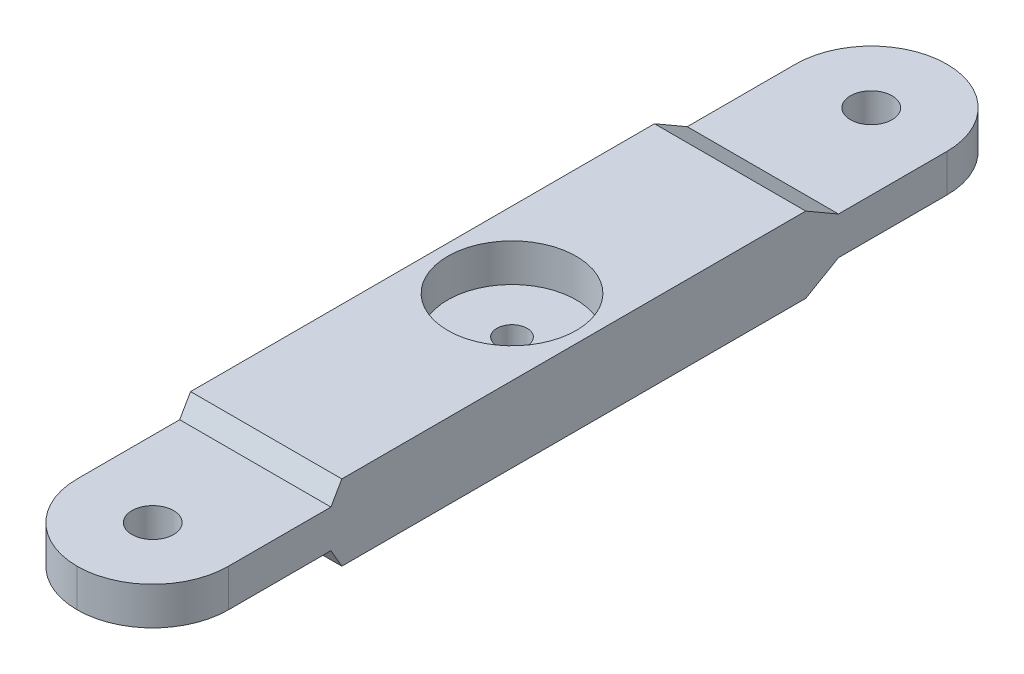
ISO-10303-21;
HEADER;
FILE_DESCRIPTION(('STEP AP214'),'2;1');
FILE_NAME('part.step','',(''),(''),'','','');
FILE_SCHEMA(('AUTOMOTIVE_DESIGN { 1 0 10303 214 1 1 1 1 }'));
ENDSEC;
DATA;
#1=APPLICATION_CONTEXT('core data for automotive mechanical design processes');
#2=APPLICATION_PROTOCOL_DEFINITION('international standard','automotive_design',2000,#1);
#3=PRODUCT_CONTEXT('',#1,'mechanical');
#4=PRODUCT('Part','Part','',(#3));
#5=PRODUCT_RELATED_PRODUCT_CATEGORY('part','',(#4));
#6=PRODUCT_DEFINITION_FORMATION('','',#4);
#7=PRODUCT_DEFINITION_CONTEXT('part definition',#1,'design');
#8=PRODUCT_DEFINITION('design','',#6,#7);
#9=PRODUCT_DEFINITION_SHAPE('','',#8);
#10=(LENGTH_UNIT() NAMED_UNIT(*) SI_UNIT(.MILLI.,.METRE.));
#11=(NAMED_UNIT(*) PLANE_ANGLE_UNIT() SI_UNIT($,.RADIAN.));
#12=(NAMED_UNIT(*) SI_UNIT($,.STERADIAN.) SOLID_ANGLE_UNIT());
#13=UNCERTAINTY_MEASURE_WITH_UNIT(LENGTH_MEASURE(1.E-05),#10,'distance_accuracy_value','');
#14=(GEOMETRIC_REPRESENTATION_CONTEXT(3) GLOBAL_UNCERTAINTY_ASSIGNED_CONTEXT((#13)) GLOBAL_UNIT_ASSIGNED_CONTEXT((#10,
#11,#12)) REPRESENTATION_CONTEXT('',''));
#15=CARTESIAN_POINT('',(0.,0.,0.));
#16=DIRECTION('',(0.,0.,1.));
#17=DIRECTION('',(1.,0.,0.));
#18=AXIS2_PLACEMENT_3D('',#15,#16,#17);
#19=CARTESIAN_POINT('',(-10.,-5.,-37.5));
#20=DIRECTION('',(-1.,0.,0.));
#21=DIRECTION('',(0.,0.,1.));
#22=AXIS2_PLACEMENT_3D('',#19,#20,#21);
#23=PLANE('',#22);
#24=DIRECTION('',(0.,0.866025403784441,0.499999999999996));
#25=VECTOR('',#24,1.);
#26=CARTESIAN_POINT('',(-10.,-35.3108891324552,15.0000000000002));
#27=LINE('',#26,#25);
#28=CARTESIAN_POINT('',(-10.,-5.,32.4999999999999));
#29=VERTEX_POINT('',#28);
#30=CARTESIAN_POINT('',(-10.,-2.5,33.943375672974));
#31=VERTEX_POINT('',#30);
#32=EDGE_CURVE('E254',#29,#31,#27,.T.);
#33=ORIENTED_EDGE('',*,*,#32,.T.);
#34=DIRECTION('',(0.,0.,-1.));
#35=VECTOR('',#34,1.);
#36=CARTESIAN_POINT('',(-10.,-2.5,57.5));
#37=LINE('',#36,#35);
#38=CARTESIAN_POINT('',(-10.,-2.5,47.5));
#39=VERTEX_POINT('',#38);
#40=EDGE_CURVE('E57',#39,#31,#37,.T.);
#41=ORIENTED_EDGE('',*,*,#40,.F.);
#42=DIRECTION('',(0.,1.,0.));
#43=VECTOR('',#42,1.);
#44=CARTESIAN_POINT('',(-10.,-5.,47.5));
#45=LINE('',#44,#43);
#46=CARTESIAN_POINT('',(-10.,2.5,47.5));
#47=VERTEX_POINT('',#46);
#48=EDGE_CURVE('E157',#39,#47,#45,.T.);
#49=ORIENTED_EDGE('',*,*,#48,.T.);
#50=DIRECTION('',(0.,0.,-1.));
#51=VECTOR('',#50,1.);
#52=CARTESIAN_POINT('',(-10.,2.5,57.5));
#53=LINE('',#52,#51);
#54=CARTESIAN_POINT('',(-10.,2.5,33.943375672974));
#55=VERTEX_POINT('',#54);
#56=EDGE_CURVE('E278',#47,#55,#53,.T.);
#57=ORIENTED_EDGE('',*,*,#56,.T.);
#58=DIRECTION('',(0.,0.866025403784441,-0.499999999999996));
#59=VECTOR('',#58,1.);
#60=CARTESIAN_POINT('',(-10.,27.8108891324551,19.3301270189224));
#61=LINE('',#60,#59);
#62=CARTESIAN_POINT('',(-10.,5.,32.4999999999999));
#63=VERTEX_POINT('',#62);
#64=EDGE_CURVE('E251',#55,#63,#61,.T.);
#65=ORIENTED_EDGE('',*,*,#64,.T.);
#66=DIRECTION('',(0.,0.,1.));
#67=VECTOR('',#66,1.);
#68=CARTESIAN_POINT('',(-10.,5.,-37.5));
#69=LINE('',#68,#67);
#70=CARTESIAN_POINT('',(-10.,5.,-28.8397459621554));
#71=VERTEX_POINT('',#70);
#72=EDGE_CURVE('E173',#71,#63,#69,.T.);
#73=ORIENTED_EDGE('',*,*,#72,.F.);
#74=DIRECTION('',(0.,0.499999999999997,0.866025403784441));
#75=VECTOR('',#74,1.);
#76=CARTESIAN_POINT('',(-10.,-1.25000000000003,-39.6650635094611));
#77=LINE('',#76,#75);
#78=CARTESIAN_POINT('',(-10.,2.5,-33.1698729810777));
#79=VERTEX_POINT('',#78);
#80=EDGE_CURVE('E248',#71,#79,#77,.F.);
#81=ORIENTED_EDGE('',*,*,#80,.T.);
#82=DIRECTION('',(0.,0.,1.));
#83=VECTOR('',#82,1.);
#84=CARTESIAN_POINT('',(-10.,2.5,-57.5));
#85=LINE('',#84,#83);
#86=CARTESIAN_POINT('',(-10.,2.5,-47.5));
#87=VERTEX_POINT('',#86);
#88=EDGE_CURVE('E74',#87,#79,#85,.T.);
#89=ORIENTED_EDGE('',*,*,#88,.F.);
#90=DIRECTION('',(0.,1.,0.));
#91=VECTOR('',#90,1.);
#92=CARTESIAN_POINT('',(-10.,-5.,-47.5));
#93=LINE('',#92,#91);
#94=CARTESIAN_POINT('',(-10.,-2.5,-47.5));
#95=VERTEX_POINT('',#94);
#96=EDGE_CURVE('E177',#87,#95,#93,.F.);
#97=ORIENTED_EDGE('',*,*,#96,.T.);
#98=DIRECTION('',(0.,0.,1.));
#99=VECTOR('',#98,1.);
#100=CARTESIAN_POINT('',(-10.,-2.5,-57.5));
#101=LINE('',#100,#99);
#102=CARTESIAN_POINT('',(-10.,-2.5,-33.1698729810777));
#103=VERTEX_POINT('',#102);
#104=EDGE_CURVE('E82',#95,#103,#101,.T.);
#105=ORIENTED_EDGE('',*,*,#104,.T.);
#106=DIRECTION('',(0.,0.499999999999997,-0.866025403784441));
#107=VECTOR('',#106,1.);
#108=CARTESIAN_POINT('',(-10.,-1.24999999999994,-35.3349364905389));
#109=LINE('',#108,#107);
#110=CARTESIAN_POINT('',(-10.,-5.,-28.8397459621554));
#111=VERTEX_POINT('',#110);
#112=EDGE_CURVE('E245',#103,#111,#109,.F.);
#113=ORIENTED_EDGE('',*,*,#112,.T.);
#114=DIRECTION('',(0.,0.,1.));
#115=VECTOR('',#114,1.);
#116=CARTESIAN_POINT('',(-10.,-5.,-37.5));
#117=LINE('',#116,#115);
#118=EDGE_CURVE('E183',#111,#29,#117,.T.);
#119=ORIENTED_EDGE('',*,*,#118,.T.);
#120=EDGE_LOOP('',(#33,#41,#49,#57,#65,#73,#81,#89,#97,#105,#113,#119));
#121=FACE_BOUND('',#120,.T.);
#122=ADVANCED_FACE('F38',(#121),#23,.T.);
#123=CARTESIAN_POINT('',(-10.,5.,-37.5));
#124=DIRECTION('',(0.,1.,0.));
#125=DIRECTION('',(0.,0.,1.));
#126=AXIS2_PLACEMENT_3D('',#123,#124,#125);
#127=PLANE('',#126);
#128=CARTESIAN_POINT('',(0.,5.,0.));
#129=DIRECTION('',(0.,1.,0.));
#130=DIRECTION('',(0.,0.,1.));
#131=AXIS2_PLACEMENT_3D('',#128,#129,#130);
#132=CIRCLE('',#131,8.5);
#133=CARTESIAN_POINT('',(0.,5.,8.5));
#134=VERTEX_POINT('',#133);
#135=EDGE_CURVE('E422',#134,#134,#132,.T.);
#136=ORIENTED_EDGE('',*,*,#135,.F.);
#137=EDGE_LOOP('',(#136));
#138=FACE_BOUND('',#137,.T.);
#139=ORIENTED_EDGE('',*,*,#72,.T.);
#140=DIRECTION('',(1.,0.,0.));
#141=VECTOR('',#140,1.);
#142=CARTESIAN_POINT('',(10.,5.,32.4999999999999));
#143=LINE('',#142,#141);
#144=CARTESIAN_POINT('',(10.,5.,32.4999999999999));
#145=VERTEX_POINT('',#144);
#146=EDGE_CURVE('E261',#63,#145,#143,.T.);
#147=ORIENTED_EDGE('',*,*,#146,.T.);
#148=DIRECTION('',(0.,0.,1.));
#149=VECTOR('',#148,1.);
#150=CARTESIAN_POINT('',(10.,5.,-37.5));
#151=LINE('',#150,#149);
#152=CARTESIAN_POINT('',(10.,5.,-28.8397459621554));
#153=VERTEX_POINT('',#152);
#154=EDGE_CURVE('E180',#153,#145,#151,.T.);
#155=ORIENTED_EDGE('',*,*,#154,.F.);
#156=DIRECTION('',(-1.,0.,0.));
#157=VECTOR('',#156,1.);
#158=CARTESIAN_POINT('',(-10.,5.,-28.8397459621554));
#159=LINE('',#158,#157);
#160=EDGE_CURVE('E257',#153,#71,#159,.T.);
#161=ORIENTED_EDGE('',*,*,#160,.T.);
#162=EDGE_LOOP('',(#139,#147,#155,#161));
#163=FACE_BOUND('',#162,.T.);
#164=ADVANCED_FACE('F286',(#138,#163),#127,.T.);
#165=CARTESIAN_POINT('',(10.,-5.,-37.5));
#166=DIRECTION('',(1.,0.,0.));
#167=DIRECTION('',(0.,0.,-1.));
#168=AXIS2_PLACEMENT_3D('',#165,#166,#167);
#169=PLANE('',#168);
#170=DIRECTION('',(0.,0.,-1.));
#171=VECTOR('',#170,1.);
#172=CARTESIAN_POINT('',(10.,-2.5,57.5));
#173=LINE('',#172,#171);
#174=CARTESIAN_POINT('',(10.,-2.5,47.5));
#175=VERTEX_POINT('',#174);
#176=CARTESIAN_POINT('',(10.,-2.5,33.943375672974));
#177=VERTEX_POINT('',#176);
#178=EDGE_CURVE('E219',#175,#177,#173,.T.);
#179=ORIENTED_EDGE('',*,*,#178,.T.);
#180=DIRECTION('',(0.,-0.866025403784441,-0.499999999999996));
#181=VECTOR('',#180,1.);
#182=CARTESIAN_POINT('',(10.,-35.3108891324552,15.0000000000002));
#183=LINE('',#182,#181);
#184=CARTESIAN_POINT('',(10.,-5.,32.4999999999999));
#185=VERTEX_POINT('',#184);
#186=EDGE_CURVE('E234',#177,#185,#183,.T.);
#187=ORIENTED_EDGE('',*,*,#186,.T.);
#188=DIRECTION('',(0.,0.,1.));
#189=VECTOR('',#188,1.);
#190=CARTESIAN_POINT('',(10.,-5.,-37.5));
#191=LINE('',#190,#189);
#192=CARTESIAN_POINT('',(10.,-5.,-28.8397459621554));
#193=VERTEX_POINT('',#192);
#194=EDGE_CURVE('E307',#193,#185,#191,.T.);
#195=ORIENTED_EDGE('',*,*,#194,.F.);
#196=DIRECTION('',(0.,-0.499999999999997,0.866025403784441));
#197=VECTOR('',#196,1.);
#198=CARTESIAN_POINT('',(10.,-1.24999999999994,-35.3349364905389));
#199=LINE('',#198,#197);
#200=CARTESIAN_POINT('',(10.,-2.5,-33.1698729810777));
#201=VERTEX_POINT('',#200);
#202=EDGE_CURVE('E214',#193,#201,#199,.F.);
#203=ORIENTED_EDGE('',*,*,#202,.T.);
#204=DIRECTION('',(0.,0.,1.));
#205=VECTOR('',#204,1.);
#206=CARTESIAN_POINT('',(10.,-2.5,-57.5));
#207=LINE('',#206,#205);
#208=CARTESIAN_POINT('',(10.,-2.5,-47.5));
#209=VERTEX_POINT('',#208);
#210=EDGE_CURVE('E152',#209,#201,#207,.T.);
#211=ORIENTED_EDGE('',*,*,#210,.F.);
#212=DIRECTION('',(0.,-1.,0.));
#213=VECTOR('',#212,1.);
#214=CARTESIAN_POINT('',(10.,-5.,-47.5));
#215=LINE('',#214,#213);
#216=CARTESIAN_POINT('',(10.,2.5,-47.5));
#217=VERTEX_POINT('',#216);
#218=EDGE_CURVE('E146',#209,#217,#215,.F.);
#219=ORIENTED_EDGE('',*,*,#218,.T.);
#220=DIRECTION('',(0.,0.,1.));
#221=VECTOR('',#220,1.);
#222=CARTESIAN_POINT('',(10.,2.5,-57.5));
#223=LINE('',#222,#221);
#224=CARTESIAN_POINT('',(10.,2.5,-33.1698729810777));
#225=VERTEX_POINT('',#224);
#226=EDGE_CURVE('E149',#217,#225,#223,.T.);
#227=ORIENTED_EDGE('',*,*,#226,.T.);
#228=DIRECTION('',(0.,-0.499999999999997,-0.866025403784441));
#229=VECTOR('',#228,1.);
#230=CARTESIAN_POINT('',(10.,-1.25000000000003,-39.6650635094611));
#231=LINE('',#230,#229);
#232=EDGE_CURVE('E227',#225,#153,#231,.F.);
#233=ORIENTED_EDGE('',*,*,#232,.T.);
#234=ORIENTED_EDGE('',*,*,#154,.T.);
#235=DIRECTION('',(0.,-0.866025403784441,0.499999999999996));
#236=VECTOR('',#235,1.);
#237=CARTESIAN_POINT('',(10.,27.8108891324551,19.3301270189224));
#238=LINE('',#237,#236);
#239=CARTESIAN_POINT('',(10.,2.5,33.943375672974));
#240=VERTEX_POINT('',#239);
#241=EDGE_CURVE('E230',#145,#240,#238,.T.);
#242=ORIENTED_EDGE('',*,*,#241,.T.);
#243=DIRECTION('',(0.,0.,-1.));
#244=VECTOR('',#243,1.);
#245=CARTESIAN_POINT('',(10.,2.5,57.5));
#246=LINE('',#245,#244);
#247=CARTESIAN_POINT('',(10.,2.5,47.5));
#248=VERTEX_POINT('',#247);
#249=EDGE_CURVE('E280',#248,#240,#246,.T.);
#250=ORIENTED_EDGE('',*,*,#249,.F.);
#251=DIRECTION('',(0.,-1.,0.));
#252=VECTOR('',#251,1.);
#253=CARTESIAN_POINT('',(10.,-5.,47.5));
#254=LINE('',#253,#252);
#255=EDGE_CURVE('E211',#248,#175,#254,.T.);
#256=ORIENTED_EDGE('',*,*,#255,.T.);
#257=EDGE_LOOP('',(#179,#187,#195,#203,#211,#219,#227,#233,#234,#242,#250,#256));
#258=FACE_BOUND('',#257,.T.);
#259=ADVANCED_FACE('F148',(#258),#169,.T.);
#260=CARTESIAN_POINT('',(-10.,-5.,-37.5));
#261=DIRECTION('',(0.,-1.,0.));
#262=DIRECTION('',(0.,0.,-1.));
#263=AXIS2_PLACEMENT_3D('',#260,#261,#262);
#264=PLANE('',#263);
#265=CARTESIAN_POINT('',(0.,-5.,0.));
#266=DIRECTION('',(0.,1.,0.));
#267=DIRECTION('',(0.,0.,1.));
#268=AXIS2_PLACEMENT_3D('',#265,#266,#267);
#269=CIRCLE('',#268,2.);
#270=CARTESIAN_POINT('',(0.,-5.,2.));
#271=VERTEX_POINT('',#270);
#272=EDGE_CURVE('E428',#271,#271,#269,.T.);
#273=ORIENTED_EDGE('',*,*,#272,.T.);
#274=EDGE_LOOP('',(#273));
#275=FACE_BOUND('',#274,.T.);
#276=ORIENTED_EDGE('',*,*,#194,.T.);
#277=DIRECTION('',(-1.,0.,0.));
#278=VECTOR('',#277,1.);
#279=CARTESIAN_POINT('',(-10.,-5.,32.4999999999999));
#280=LINE('',#279,#278);
#281=EDGE_CURVE('E241',#185,#29,#280,.T.);
#282=ORIENTED_EDGE('',*,*,#281,.T.);
#283=ORIENTED_EDGE('',*,*,#118,.F.);
#284=DIRECTION('',(1.,0.,0.));
#285=VECTOR('',#284,1.);
#286=CARTESIAN_POINT('',(-10.,-5.,-28.8397459621554));
#287=LINE('',#286,#285);
#288=EDGE_CURVE('E237',#111,#193,#287,.T.);
#289=ORIENTED_EDGE('',*,*,#288,.T.);
#290=EDGE_LOOP('',(#276,#282,#283,#289));
#291=FACE_BOUND('',#290,.T.);
#292=ADVANCED_FACE('F318',(#275,#291),#264,.T.);
#293=CARTESIAN_POINT('',(10.,-2.5,-57.5));
#294=DIRECTION('',(0.,1.,0.));
#295=DIRECTION('',(0.,0.,1.));
#296=AXIS2_PLACEMENT_3D('',#293,#294,#295);
#297=PLANE('',#296);
#298=CARTESIAN_POINT('',(0.,-2.5,-47.5));
#299=DIRECTION('',(0.,1.,0.));
#300=DIRECTION('',(0.,0.,1.));
#301=AXIS2_PLACEMENT_3D('',#298,#299,#300);
#302=CIRCLE('',#301,2.75);
#303=CARTESIAN_POINT('',(0.,-2.5,-44.75));
#304=VERTEX_POINT('',#303);
#305=EDGE_CURVE('E195',#304,#304,#302,.T.);
#306=ORIENTED_EDGE('',*,*,#305,.T.);
#307=EDGE_LOOP('',(#306));
#308=FACE_BOUND('',#307,.T.);
#309=ORIENTED_EDGE('',*,*,#104,.F.);
#310=CARTESIAN_POINT('',(0.,-2.5,-47.5));
#311=DIRECTION('',(0.,1.,0.));
#312=DIRECTION('',(0.,0.,1.));
#313=AXIS2_PLACEMENT_3D('',#310,#311,#312);
#314=CIRCLE('',#313,10.);
#315=CARTESIAN_POINT('',(0.,-2.5,-57.5));
#316=VERTEX_POINT('',#315);
#317=EDGE_CURVE('E158',#95,#316,#314,.F.);
#318=ORIENTED_EDGE('',*,*,#317,.T.);
#319=CARTESIAN_POINT('',(0.,-2.5,-47.5));
#320=DIRECTION('',(0.,1.,0.));
#321=DIRECTION('',(0.,0.,1.));
#322=AXIS2_PLACEMENT_3D('',#319,#320,#321);
#323=CIRCLE('',#322,10.);
#324=EDGE_CURVE('E188',#316,#209,#323,.F.);
#325=ORIENTED_EDGE('',*,*,#324,.T.);
#326=ORIENTED_EDGE('',*,*,#210,.T.);
#327=DIRECTION('',(1.,0.,0.));
#328=VECTOR('',#327,1.);
#329=CARTESIAN_POINT('',(10.,-2.5,-33.1698729810777));
#330=LINE('',#329,#328);
#331=EDGE_CURVE('E11',#201,#103,#330,.F.);
#332=ORIENTED_EDGE('',*,*,#331,.T.);
#333=EDGE_LOOP('',(#309,#318,#325,#326,#332));
#334=FACE_BOUND('',#333,.T.);
#335=ADVANCED_FACE('F298',(#308,#334),#297,.F.);
#336=CARTESIAN_POINT('',(10.,2.5,-57.5));
#337=DIRECTION('',(0.,-1.,0.));
#338=DIRECTION('',(0.,0.,-1.));
#339=AXIS2_PLACEMENT_3D('',#336,#337,#338);
#340=PLANE('',#339);
#341=CARTESIAN_POINT('',(0.,2.5,-47.5));
#342=DIRECTION('',(0.,1.,0.));
#343=DIRECTION('',(0.,0.,1.));
#344=AXIS2_PLACEMENT_3D('',#341,#342,#343);
#345=CIRCLE('',#344,2.75);
#346=CARTESIAN_POINT('',(0.,2.5,-44.75));
#347=VERTEX_POINT('',#346);
#348=EDGE_CURVE('E345',#347,#347,#345,.T.);
#349=ORIENTED_EDGE('',*,*,#348,.F.);
#350=EDGE_LOOP('',(#349));
#351=FACE_BOUND('',#350,.T.);
#352=CARTESIAN_POINT('',(0.,2.5,-47.5));
#353=DIRECTION('',(0.,-1.,0.));
#354=DIRECTION('',(0.,0.,-1.));
#355=AXIS2_PLACEMENT_3D('',#352,#353,#354);
#356=CIRCLE('',#355,10.);
#357=CARTESIAN_POINT('',(0.,2.5,-57.5));
#358=VERTEX_POINT('',#357);
#359=EDGE_CURVE('E161',#217,#358,#356,.F.);
#360=ORIENTED_EDGE('',*,*,#359,.T.);
#361=CARTESIAN_POINT('',(0.,2.5,-47.5));
#362=DIRECTION('',(0.,-1.,0.));
#363=DIRECTION('',(0.,0.,-1.));
#364=AXIS2_PLACEMENT_3D('',#361,#362,#363);
#365=CIRCLE('',#364,10.);
#366=EDGE_CURVE('E172',#358,#87,#365,.F.);
#367=ORIENTED_EDGE('',*,*,#366,.T.);
#368=ORIENTED_EDGE('',*,*,#88,.T.);
#369=DIRECTION('',(-1.,0.,0.));
#370=VECTOR('',#369,1.);
#371=CARTESIAN_POINT('',(10.,2.5,-33.1698729810777));
#372=LINE('',#371,#370);
#373=EDGE_CURVE('E49',#79,#225,#372,.F.);
#374=ORIENTED_EDGE('',*,*,#373,.T.);
#375=ORIENTED_EDGE('',*,*,#226,.F.);
#376=EDGE_LOOP('',(#360,#367,#368,#374,#375));
#377=FACE_BOUND('',#376,.T.);
#378=ADVANCED_FACE('F160',(#351,#377),#340,.F.);
#379=CARTESIAN_POINT('',(0.,0.,-47.5));
#380=DIRECTION('',(0.,-1.,0.));
#381=DIRECTION('',(0.,0.,-1.));
#382=AXIS2_PLACEMENT_3D('',#379,#380,#381);
#383=CYLINDRICAL_SURFACE('',#382,10.);
#384=ORIENTED_EDGE('',*,*,#218,.F.);
#385=ORIENTED_EDGE('',*,*,#324,.F.);
#386=DIRECTION('',(0.,-1.,0.));
#387=VECTOR('',#386,1.);
#388=CARTESIAN_POINT('',(0.,0.,-57.5));
#389=LINE('',#388,#387);
#390=EDGE_CURVE('E166',#358,#316,#389,.T.);
#391=ORIENTED_EDGE('',*,*,#390,.F.);
#392=ORIENTED_EDGE('',*,*,#359,.F.);
#393=EDGE_LOOP('',(#384,#385,#391,#392));
#394=FACE_BOUND('',#393,.T.);
#395=ADVANCED_FACE('F168',(#394),#383,.T.);
#396=CARTESIAN_POINT('',(0.,0.,-47.5));
#397=DIRECTION('',(0.,1.,0.));
#398=DIRECTION('',(0.,0.,1.));
#399=AXIS2_PLACEMENT_3D('',#396,#397,#398);
#400=CYLINDRICAL_SURFACE('',#399,10.);
#401=ORIENTED_EDGE('',*,*,#317,.F.);
#402=ORIENTED_EDGE('',*,*,#96,.F.);
#403=ORIENTED_EDGE('',*,*,#366,.F.);
#404=ORIENTED_EDGE('',*,*,#390,.T.);
#405=EDGE_LOOP('',(#401,#402,#403,#404));
#406=FACE_BOUND('',#405,.T.);
#407=ADVANCED_FACE('F296',(#406),#400,.T.);
#408=CARTESIAN_POINT('',(0.,-5.,-47.5));
#409=DIRECTION('',(0.,1.,0.));
#410=DIRECTION('',(0.,0.,1.));
#411=AXIS2_PLACEMENT_3D('',#408,#409,#410);
#412=CYLINDRICAL_SURFACE('',#411,2.75);
#413=CARTESIAN_POINT('',(0.,2.5,-44.75));
#414=CARTESIAN_POINT('',(0.,2.44791666666667,-44.75));
#415=CARTESIAN_POINT('',(0.,2.39583333333333,-44.75));
#416=CARTESIAN_POINT('',(0.,2.29166666666667,-44.75));
#417=CARTESIAN_POINT('',(0.,2.23958333333333,-44.75));
#418=CARTESIAN_POINT('',(0.,2.13541666666667,-44.75));
#419=CARTESIAN_POINT('',(0.,2.08333333333333,-44.75));
#420=CARTESIAN_POINT('',(0.,1.97916666666667,-44.75));
#421=CARTESIAN_POINT('',(0.,1.92708333333333,-44.75));
#422=CARTESIAN_POINT('',(0.,1.82291666666667,-44.75));
#423=CARTESIAN_POINT('',(0.,1.77083333333333,-44.75));
#424=CARTESIAN_POINT('',(0.,1.66666666666667,-44.75));
#425=CARTESIAN_POINT('',(0.,1.61458333333333,-44.75));
#426=CARTESIAN_POINT('',(0.,1.51041666666667,-44.75));
#427=CARTESIAN_POINT('',(0.,1.45833333333333,-44.75));
#428=CARTESIAN_POINT('',(0.,1.35416666666667,-44.75));
#429=CARTESIAN_POINT('',(0.,1.30208333333333,-44.75));
#430=CARTESIAN_POINT('',(0.,1.19791666666667,-44.75));
#431=CARTESIAN_POINT('',(0.,1.14583333333333,-44.75));
#432=CARTESIAN_POINT('',(0.,1.04166666666667,-44.75));
#433=CARTESIAN_POINT('',(0.,0.989583333333333,-44.75));
#434=CARTESIAN_POINT('',(0.,0.885416666666667,-44.75));
#435=CARTESIAN_POINT('',(0.,0.833333333333333,-44.75));
#436=CARTESIAN_POINT('',(0.,0.729166666666667,-44.75));
#437=CARTESIAN_POINT('',(0.,0.677083333333333,-44.75));
#438=CARTESIAN_POINT('',(0.,0.572916666666666,-44.75));
#439=CARTESIAN_POINT('',(0.,0.520833333333333,-44.75));
#440=CARTESIAN_POINT('',(0.,0.416666666666666,-44.75));
#441=CARTESIAN_POINT('',(0.,0.364583333333333,-44.75));
#442=CARTESIAN_POINT('',(0.,0.260416666666667,-44.75));
#443=CARTESIAN_POINT('',(0.,0.208333333333334,-44.75));
#444=CARTESIAN_POINT('',(0.,0.104166666666667,-44.75));
#445=CARTESIAN_POINT('',(0.,0.0520833333333334,-44.75));
#446=CARTESIAN_POINT('',(0.,-0.0520833333333334,-44.75));
#447=CARTESIAN_POINT('',(0.,-0.104166666666667,-44.75));
#448=CARTESIAN_POINT('',(0.,-0.208333333333334,-44.75));
#449=CARTESIAN_POINT('',(0.,-0.260416666666667,-44.75));
#450=CARTESIAN_POINT('',(0.,-0.364583333333334,-44.75));
#451=CARTESIAN_POINT('',(0.,-0.416666666666667,-44.75));
#452=CARTESIAN_POINT('',(0.,-0.520833333333334,-44.75));
#453=CARTESIAN_POINT('',(0.,-0.572916666666667,-44.75));
#454=CARTESIAN_POINT('',(0.,-0.677083333333334,-44.75));
#455=CARTESIAN_POINT('',(0.,-0.729166666666667,-44.75));
#456=CARTESIAN_POINT('',(0.,-0.833333333333334,-44.75));
#457=CARTESIAN_POINT('',(0.,-0.885416666666668,-44.75));
#458=CARTESIAN_POINT('',(0.,-0.989583333333334,-44.75));
#459=CARTESIAN_POINT('',(0.,-1.04166666666667,-44.75));
#460=CARTESIAN_POINT('',(0.,-1.14583333333333,-44.75));
#461=CARTESIAN_POINT('',(0.,-1.19791666666667,-44.75));
#462=CARTESIAN_POINT('',(0.,-1.30208333333333,-44.75));
#463=CARTESIAN_POINT('',(0.,-1.35416666666667,-44.75));
#464=CARTESIAN_POINT('',(0.,-1.45833333333333,-44.75));
#465=CARTESIAN_POINT('',(0.,-1.51041666666667,-44.75));
#466=CARTESIAN_POINT('',(0.,-1.61458333333333,-44.75));
#467=CARTESIAN_POINT('',(0.,-1.66666666666667,-44.75));
#468=CARTESIAN_POINT('',(0.,-1.77083333333333,-44.75));
#469=CARTESIAN_POINT('',(0.,-1.82291666666667,-44.75));
#470=CARTESIAN_POINT('',(0.,-1.92708333333333,-44.75));
#471=CARTESIAN_POINT('',(0.,-1.97916666666667,-44.75));
#472=CARTESIAN_POINT('',(0.,-2.08333333333333,-44.75));
#473=CARTESIAN_POINT('',(0.,-2.13541666666667,-44.75));
#474=CARTESIAN_POINT('',(0.,-2.23958333333333,-44.75));
#475=CARTESIAN_POINT('',(0.,-2.29166666666667,-44.75));
#476=CARTESIAN_POINT('',(0.,-2.39583333333333,-44.75));
#477=CARTESIAN_POINT('',(0.,-2.44791666666667,-44.75));
#478=CARTESIAN_POINT('',(0.,-2.5,-44.75));
#479=B_SPLINE_CURVE_WITH_KNOTS('',3,(#413,#414,#415,#416,#417,#418,#419,#420,#421,#422,#423,
#424,#425,#426,#427,#428,#429,#430,#431,#432,#433,#434,#435,#436,#437,#438,#439,#440,#441,#442,
#443,#444,#445,#446,#447,#448,#449,#450,#451,#452,#453,#454,#455,#456,#457,#458,#459,#460,#461,
#462,#463,#464,#465,#466,#467,#468,#469,#470,#471,#472,#473,#474,#475,#476,#477,#478),
.UNSPECIFIED.,.F.,.F.,(4,2,2,2,2,2,2,2,2,2,2,2,2,2,2,2,2,2,2,2,2,2,2,2,2,2,2,2,2,2,2,2,4),(0.,
0.15625,0.3125,0.46875,0.625000000000001,0.781250000000001,0.937500000000001,1.09375,1.25,
1.40625,1.5625,1.71875,1.875,2.03125,2.1875,2.34375,2.5,2.65625,2.8125,2.96875,3.125,3.28125,
3.4375,3.59375,3.75,3.90625,4.0625,4.21875,4.375,4.53125,4.6875,4.84375,5.),.UNSPECIFIED.);
#480=EDGE_CURVE('BSEAM354',#347,#304,#479,.T.);
#481=ORIENTED_EDGE('',*,*,#348,.T.);
#482=ORIENTED_EDGE('',*,*,#305,.F.);
#483=ORIENTED_EDGE('',*,*,#480,.T.);
#484=ORIENTED_EDGE('',*,*,#480,.F.);
#485=EDGE_LOOP('',(#481,#483,#482,#484));
#486=FACE_BOUND('',#485,.T.);
#487=ADVANCED_FACE('F354',(#486),#412,.F.);
#488=CARTESIAN_POINT('',(10.,2.5,57.5));
#489=DIRECTION('',(0.,1.,0.));
#490=DIRECTION('',(0.,0.,1.));
#491=AXIS2_PLACEMENT_3D('',#488,#489,#490);
#492=PLANE('',#491);
#493=CARTESIAN_POINT('',(0.,2.5,47.5));
#494=DIRECTION('',(0.,-1.,0.));
#495=DIRECTION('',(0.,0.,-1.));
#496=AXIS2_PLACEMENT_3D('',#493,#494,#495);
#497=CIRCLE('',#496,2.75);
#498=CARTESIAN_POINT('',(0.,2.5,50.25));
#499=VERTEX_POINT('',#498);
#500=EDGE_CURVE('E224',#499,#499,#497,.T.);
#501=ORIENTED_EDGE('',*,*,#500,.T.);
#502=EDGE_LOOP('',(#501));
#503=FACE_BOUND('',#502,.T.);
#504=ORIENTED_EDGE('',*,*,#56,.F.);
#505=CARTESIAN_POINT('',(0.,2.5,47.5));
#506=DIRECTION('',(0.,1.,0.));
#507=DIRECTION('',(0.,0.,1.));
#508=AXIS2_PLACEMENT_3D('',#505,#506,#507);
#509=CIRCLE('',#508,10.);
#510=CARTESIAN_POINT('',(0.,2.5,57.5));
#511=VERTEX_POINT('',#510);
#512=EDGE_CURVE('E202',#47,#511,#509,.T.);
#513=ORIENTED_EDGE('',*,*,#512,.T.);
#514=CARTESIAN_POINT('',(0.,2.5,47.5));
#515=DIRECTION('',(0.,1.,0.));
#516=DIRECTION('',(0.,0.,1.));
#517=AXIS2_PLACEMENT_3D('',#514,#515,#516);
#518=CIRCLE('',#517,10.);
#519=EDGE_CURVE('E199',#511,#248,#518,.T.);
#520=ORIENTED_EDGE('',*,*,#519,.T.);
#521=ORIENTED_EDGE('',*,*,#249,.T.);
#522=DIRECTION('',(-1.,0.,0.));
#523=VECTOR('',#522,1.);
#524=CARTESIAN_POINT('',(0.,2.5,33.943375672974));
#525=LINE('',#524,#523);
#526=EDGE_CURVE('E268',#240,#55,#525,.T.);
#527=ORIENTED_EDGE('',*,*,#526,.T.);
#528=EDGE_LOOP('',(#504,#513,#520,#521,#527));
#529=FACE_BOUND('',#528,.T.);
#530=ADVANCED_FACE('F277',(#503,#529),#492,.T.);
#531=CARTESIAN_POINT('',(10.,-2.5,57.5));
#532=DIRECTION('',(0.,-1.,0.));
#533=DIRECTION('',(0.,0.,-1.));
#534=AXIS2_PLACEMENT_3D('',#531,#532,#533);
#535=PLANE('',#534);
#536=CARTESIAN_POINT('',(0.,-2.5,47.5));
#537=DIRECTION('',(0.,-1.,0.));
#538=DIRECTION('',(0.,0.,-1.));
#539=AXIS2_PLACEMENT_3D('',#536,#537,#538);
#540=CIRCLE('',#539,2.75);
#541=CARTESIAN_POINT('',(0.,-2.5,50.25));
#542=VERTEX_POINT('',#541);
#543=EDGE_CURVE('E220',#542,#542,#540,.F.);
#544=ORIENTED_EDGE('',*,*,#543,.T.);
#545=EDGE_LOOP('',(#544));
#546=FACE_BOUND('',#545,.T.);
#547=CARTESIAN_POINT('',(0.,-2.5,47.5));
#548=DIRECTION('',(0.,-1.,0.));
#549=DIRECTION('',(0.,0.,-1.));
#550=AXIS2_PLACEMENT_3D('',#547,#548,#549);
#551=CIRCLE('',#550,10.);
#552=CARTESIAN_POINT('',(0.,-2.5,57.5));
#553=VERTEX_POINT('',#552);
#554=EDGE_CURVE('E205',#175,#553,#551,.T.);
#555=ORIENTED_EDGE('',*,*,#554,.T.);
#556=CARTESIAN_POINT('',(0.,-2.5,47.5));
#557=DIRECTION('',(0.,-1.,0.));
#558=DIRECTION('',(0.,0.,-1.));
#559=AXIS2_PLACEMENT_3D('',#556,#557,#558);
#560=CIRCLE('',#559,10.);
#561=EDGE_CURVE('E208',#553,#39,#560,.T.);
#562=ORIENTED_EDGE('',*,*,#561,.T.);
#563=ORIENTED_EDGE('',*,*,#40,.T.);
#564=DIRECTION('',(1.,0.,0.));
#565=VECTOR('',#564,1.);
#566=CARTESIAN_POINT('',(0.,-2.5,33.943375672974));
#567=LINE('',#566,#565);
#568=EDGE_CURVE('E265',#31,#177,#567,.T.);
#569=ORIENTED_EDGE('',*,*,#568,.T.);
#570=ORIENTED_EDGE('',*,*,#178,.F.);
#571=EDGE_LOOP('',(#555,#562,#563,#569,#570));
#572=FACE_BOUND('',#571,.T.);
#573=ADVANCED_FACE('F324',(#546,#572),#535,.T.);
#574=CARTESIAN_POINT('',(0.,-5.,47.5));
#575=DIRECTION('',(0.,-1.,0.));
#576=DIRECTION('',(0.,0.,-1.));
#577=AXIS2_PLACEMENT_3D('',#574,#575,#576);
#578=CYLINDRICAL_SURFACE('',#577,10.);
#579=DIRECTION('',(0.,-1.,0.));
#580=VECTOR('',#579,1.);
#581=CARTESIAN_POINT('',(0.,0.,57.5));
#582=LINE('',#581,#580);
#583=EDGE_CURVE('E215',#553,#511,#582,.F.);
#584=ORIENTED_EDGE('',*,*,#583,.F.);
#585=ORIENTED_EDGE('',*,*,#554,.F.);
#586=ORIENTED_EDGE('',*,*,#255,.F.);
#587=ORIENTED_EDGE('',*,*,#519,.F.);
#588=EDGE_LOOP('',(#584,#585,#586,#587));
#589=FACE_BOUND('',#588,.T.);
#590=ADVANCED_FACE('F331',(#589),#578,.T.);
#591=CARTESIAN_POINT('',(0.,-5.,47.5));
#592=DIRECTION('',(0.,1.,0.));
#593=DIRECTION('',(0.,0.,1.));
#594=AXIS2_PLACEMENT_3D('',#591,#592,#593);
#595=CYLINDRICAL_SURFACE('',#594,10.);
#596=ORIENTED_EDGE('',*,*,#561,.F.);
#597=ORIENTED_EDGE('',*,*,#583,.T.);
#598=ORIENTED_EDGE('',*,*,#512,.F.);
#599=ORIENTED_EDGE('',*,*,#48,.F.);
#600=EDGE_LOOP('',(#596,#597,#598,#599));
#601=FACE_BOUND('',#600,.T.);
#602=ADVANCED_FACE('F336',(#601),#595,.T.);
#603=CARTESIAN_POINT('',(0.,-5.,47.5));
#604=DIRECTION('',(0.,1.,0.));
#605=DIRECTION('',(0.,0.,1.));
#606=AXIS2_PLACEMENT_3D('',#603,#604,#605);
#607=CYLINDRICAL_SURFACE('',#606,2.75);
#608=CARTESIAN_POINT('',(0.,-2.5,50.25));
#609=CARTESIAN_POINT('',(0.,-2.44791666666667,50.25));
#610=CARTESIAN_POINT('',(0.,-2.39583333333333,50.25));
#611=CARTESIAN_POINT('',(0.,-2.29166666666667,50.25));
#612=CARTESIAN_POINT('',(0.,-2.23958333333333,50.25));
#613=CARTESIAN_POINT('',(0.,-2.13541666666667,50.25));
#614=CARTESIAN_POINT('',(0.,-2.08333333333333,50.25));
#615=CARTESIAN_POINT('',(0.,-1.97916666666667,50.25));
#616=CARTESIAN_POINT('',(0.,-1.92708333333333,50.25));
#617=CARTESIAN_POINT('',(0.,-1.82291666666667,50.25));
#618=CARTESIAN_POINT('',(0.,-1.77083333333333,50.25));
#619=CARTESIAN_POINT('',(0.,-1.66666666666667,50.25));
#620=CARTESIAN_POINT('',(0.,-1.61458333333333,50.25));
#621=CARTESIAN_POINT('',(0.,-1.51041666666667,50.25));
#622=CARTESIAN_POINT('',(0.,-1.45833333333333,50.25));
#623=CARTESIAN_POINT('',(0.,-1.35416666666667,50.25));
#624=CARTESIAN_POINT('',(0.,-1.30208333333333,50.25));
#625=CARTESIAN_POINT('',(0.,-1.19791666666667,50.25));
#626=CARTESIAN_POINT('',(0.,-1.14583333333333,50.25));
#627=CARTESIAN_POINT('',(0.,-1.04166666666667,50.25));
#628=CARTESIAN_POINT('',(0.,-0.989583333333333,50.25));
#629=CARTESIAN_POINT('',(0.,-0.885416666666667,50.25));
#630=CARTESIAN_POINT('',(0.,-0.833333333333334,50.25));
#631=CARTESIAN_POINT('',(0.,-0.729166666666667,50.25));
#632=CARTESIAN_POINT('',(0.,-0.677083333333334,50.25));
#633=CARTESIAN_POINT('',(0.,-0.572916666666667,50.25));
#634=CARTESIAN_POINT('',(0.,-0.520833333333334,50.25));
#635=CARTESIAN_POINT('',(0.,-0.416666666666667,50.25));
#636=CARTESIAN_POINT('',(0.,-0.364583333333334,50.25));
#637=CARTESIAN_POINT('',(0.,-0.260416666666667,50.25));
#638=CARTESIAN_POINT('',(0.,-0.208333333333334,50.25));
#639=CARTESIAN_POINT('',(0.,-0.104166666666667,50.25));
#640=CARTESIAN_POINT('',(0.,-0.0520833333333334,50.25));
#641=CARTESIAN_POINT('',(0.,0.0520833333333334,50.25));
#642=CARTESIAN_POINT('',(0.,0.104166666666667,50.25));
#643=CARTESIAN_POINT('',(0.,0.208333333333334,50.25));
#644=CARTESIAN_POINT('',(0.,0.260416666666667,50.25));
#645=CARTESIAN_POINT('',(0.,0.364583333333334,50.25));
#646=CARTESIAN_POINT('',(0.,0.416666666666667,50.25));
#647=CARTESIAN_POINT('',(0.,0.520833333333334,50.25));
#648=CARTESIAN_POINT('',(0.,0.572916666666667,50.25));
#649=CARTESIAN_POINT('',(0.,0.677083333333334,50.25));
#650=CARTESIAN_POINT('',(0.,0.729166666666667,50.25));
#651=CARTESIAN_POINT('',(0.,0.833333333333334,50.25));
#652=CARTESIAN_POINT('',(0.,0.885416666666667,50.25));
#653=CARTESIAN_POINT('',(0.,0.989583333333333,50.25));
#654=CARTESIAN_POINT('',(0.,1.04166666666667,50.25));
#655=CARTESIAN_POINT('',(0.,1.14583333333333,50.25));
#656=CARTESIAN_POINT('',(0.,1.19791666666667,50.25));
#657=CARTESIAN_POINT('',(0.,1.30208333333333,50.25));
#658=CARTESIAN_POINT('',(0.,1.35416666666667,50.25));
#659=CARTESIAN_POINT('',(0.,1.45833333333333,50.25));
#660=CARTESIAN_POINT('',(0.,1.51041666666667,50.25));
#661=CARTESIAN_POINT('',(0.,1.61458333333333,50.25));
#662=CARTESIAN_POINT('',(0.,1.66666666666667,50.25));
#663=CARTESIAN_POINT('',(0.,1.77083333333333,50.25));
#664=CARTESIAN_POINT('',(0.,1.82291666666667,50.25));
#665=CARTESIAN_POINT('',(0.,1.92708333333333,50.25));
#666=CARTESIAN_POINT('',(0.,1.97916666666667,50.25));
#667=CARTESIAN_POINT('',(0.,2.08333333333333,50.25));
#668=CARTESIAN_POINT('',(0.,2.13541666666667,50.25));
#669=CARTESIAN_POINT('',(0.,2.23958333333333,50.25));
#670=CARTESIAN_POINT('',(0.,2.29166666666667,50.25));
#671=CARTESIAN_POINT('',(0.,2.39583333333333,50.25));
#672=CARTESIAN_POINT('',(0.,2.44791666666667,50.25));
#673=CARTESIAN_POINT('',(0.,2.5,50.25));
#674=B_SPLINE_CURVE_WITH_KNOTS('',3,(#608,#609,#610,#611,#612,#613,#614,#615,#616,#617,#618,
#619,#620,#621,#622,#623,#624,#625,#626,#627,#628,#629,#630,#631,#632,#633,#634,#635,#636,#637,
#638,#639,#640,#641,#642,#643,#644,#645,#646,#647,#648,#649,#650,#651,#652,#653,#654,#655,#656,
#657,#658,#659,#660,#661,#662,#663,#664,#665,#666,#667,#668,#669,#670,#671,#672,#673),
.UNSPECIFIED.,.F.,.F.,(4,2,2,2,2,2,2,2,2,2,2,2,2,2,2,2,2,2,2,2,2,2,2,2,2,2,2,2,2,2,2,2,4),(0.,
0.15625,0.3125,0.46875,0.625,0.78125,0.9375,1.09375,1.25,1.40625,1.5625,1.71875,1.875,2.03125,
2.1875,2.34375,2.5,2.65625,2.8125,2.96875,3.125,3.28125,3.4375,3.59375,3.75,3.90625,4.0625,
4.21875,4.375,4.53125,4.6875,4.84375,5.),.UNSPECIFIED.);
#675=EDGE_CURVE('BSEAM380',#542,#499,#674,.T.);
#676=ORIENTED_EDGE('',*,*,#543,.F.);
#677=ORIENTED_EDGE('',*,*,#500,.F.);
#678=ORIENTED_EDGE('',*,*,#675,.T.);
#679=ORIENTED_EDGE('',*,*,#675,.F.);
#680=EDGE_LOOP('',(#676,#678,#677,#679));
#681=FACE_BOUND('',#680,.T.);
#682=ADVANCED_FACE('F380',(#681),#607,.F.);
#683=CARTESIAN_POINT('',(0.,3.66025403784457,37.5));
#684=DIRECTION('',(0.,-0.499999999999996,0.866025403784441));
#685=DIRECTION('',(-1.,0.,0.));
#686=AXIS2_PLACEMENT_3D('',#683,#684,#685);
#687=PLANE('',#686);
#688=ORIENTED_EDGE('',*,*,#32,.F.);
#689=ORIENTED_EDGE('',*,*,#281,.F.);
#690=ORIENTED_EDGE('',*,*,#186,.F.);
#691=ORIENTED_EDGE('',*,*,#568,.F.);
#692=EDGE_LOOP('',(#688,#689,#690,#691));
#693=FACE_BOUND('',#692,.T.);
#694=ADVANCED_FACE('F323',(#693),#687,.T.);
#695=CARTESIAN_POINT('',(0.,-3.66025403784457,37.5));
#696=DIRECTION('',(0.,0.499999999999996,0.866025403784441));
#697=DIRECTION('',(1.,0.,0.));
#698=AXIS2_PLACEMENT_3D('',#695,#696,#697);
#699=PLANE('',#698);
#700=ORIENTED_EDGE('',*,*,#241,.F.);
#701=ORIENTED_EDGE('',*,*,#146,.F.);
#702=ORIENTED_EDGE('',*,*,#64,.F.);
#703=ORIENTED_EDGE('',*,*,#526,.F.);
#704=EDGE_LOOP('',(#700,#701,#702,#703));
#705=FACE_BOUND('',#704,.T.);
#706=ADVANCED_FACE('F283',(#705),#699,.T.);
#707=CARTESIAN_POINT('',(-10.,5.,-28.8397459621554));
#708=DIRECTION('',(0.,-0.866025403784441,0.499999999999996));
#709=DIRECTION('',(-1.,0.,0.));
#710=AXIS2_PLACEMENT_3D('',#707,#708,#709);
#711=PLANE('',#710);
#712=ORIENTED_EDGE('',*,*,#232,.F.);
#713=ORIENTED_EDGE('',*,*,#373,.F.);
#714=ORIENTED_EDGE('',*,*,#80,.F.);
#715=ORIENTED_EDGE('',*,*,#160,.F.);
#716=EDGE_LOOP('',(#712,#713,#714,#715));
#717=FACE_BOUND('',#716,.T.);
#718=ADVANCED_FACE('F291',(#717),#711,.F.);
#719=CARTESIAN_POINT('',(-10.,-5.,-28.8397459621554));
#720=DIRECTION('',(0.,0.866025403784441,0.499999999999996));
#721=DIRECTION('',(1.,0.,0.));
#722=AXIS2_PLACEMENT_3D('',#719,#720,#721);
#723=PLANE('',#722);
#724=ORIENTED_EDGE('',*,*,#112,.F.);
#725=ORIENTED_EDGE('',*,*,#331,.F.);
#726=ORIENTED_EDGE('',*,*,#202,.F.);
#727=ORIENTED_EDGE('',*,*,#288,.F.);
#728=EDGE_LOOP('',(#724,#725,#726,#727));
#729=FACE_BOUND('',#728,.T.);
#730=ADVANCED_FACE('F40',(#729),#723,.F.);
#731=CARTESIAN_POINT('',(0.,0.,0.));
#732=DIRECTION('',(0.,1.,0.));
#733=DIRECTION('',(0.,0.,1.));
#734=AXIS2_PLACEMENT_3D('',#731,#732,#733);
#735=CYLINDRICAL_SURFACE('',#734,8.5);
#736=CARTESIAN_POINT('',(0.,0.,0.));
#737=DIRECTION('',(0.,1.,0.));
#738=DIRECTION('',(0.,0.,1.));
#739=AXIS2_PLACEMENT_3D('',#736,#737,#738);
#740=CIRCLE('',#739,8.5);
#741=CARTESIAN_POINT('',(0.,0.,8.5));
#742=VERTEX_POINT('',#741);
#743=EDGE_CURVE('E419',#742,#742,#740,.T.);
#744=ORIENTED_EDGE('',*,*,#743,.F.);
#745=EDGE_LOOP('',(#744));
#746=FACE_BOUND('',#745,.T.);
#747=ORIENTED_EDGE('',*,*,#135,.T.);
#748=EDGE_LOOP('',(#747));
#749=FACE_BOUND('',#748,.T.);
#750=ADVANCED_FACE('F390',(#746,#749),#735,.F.);
#751=CARTESIAN_POINT('',(0.,0.,0.));
#752=DIRECTION('',(0.,1.,0.));
#753=DIRECTION('',(0.,0.,1.));
#754=AXIS2_PLACEMENT_3D('',#751,#752,#753);
#755=PLANE('',#754);
#756=CARTESIAN_POINT('',(0.,0.,0.));
#757=DIRECTION('',(0.,1.,0.));
#758=DIRECTION('',(0.,0.,1.));
#759=AXIS2_PLACEMENT_3D('',#756,#757,#758);
#760=CIRCLE('',#759,2.);
#761=CARTESIAN_POINT('',(0.,0.,2.));
#762=VERTEX_POINT('',#761);
#763=EDGE_CURVE('E42',#762,#762,#760,.T.);
#764=ORIENTED_EDGE('',*,*,#763,.F.);
#765=EDGE_LOOP('',(#764));
#766=FACE_BOUND('',#765,.T.);
#767=ORIENTED_EDGE('',*,*,#743,.T.);
#768=EDGE_LOOP('',(#767));
#769=FACE_BOUND('',#768,.T.);
#770=ADVANCED_FACE('F394',(#766,#769),#755,.T.);
#771=CARTESIAN_POINT('',(0.,-5.,0.));
#772=DIRECTION('',(0.,1.,0.));
#773=DIRECTION('',(0.,0.,1.));
#774=AXIS2_PLACEMENT_3D('',#771,#772,#773);
#775=CYLINDRICAL_SURFACE('',#774,2.);
#776=ORIENTED_EDGE('',*,*,#763,.T.);
#777=EDGE_LOOP('',(#776));
#778=FACE_BOUND('',#777,.T.);
#779=ORIENTED_EDGE('',*,*,#272,.F.);
#780=EDGE_LOOP('',(#779));
#781=FACE_BOUND('',#780,.T.);
#782=ADVANCED_FACE('F400',(#778,#781),#775,.F.);
#783=CLOSED_SHELL('',(#122,#164,#259,#292,#335,#378,#395,#407,#487,#530,#573,#590,#602,#682,
#694,#706,#718,#730,#750,#770,#782));
#784=MANIFOLD_SOLID_BREP('B2',#783);
#785=ADVANCED_BREP_SHAPE_REPRESENTATION('',(#18,#784),#14);
#786=SHAPE_DEFINITION_REPRESENTATION(#9,#785);
ENDSEC;
END-ISO-10303-21;
